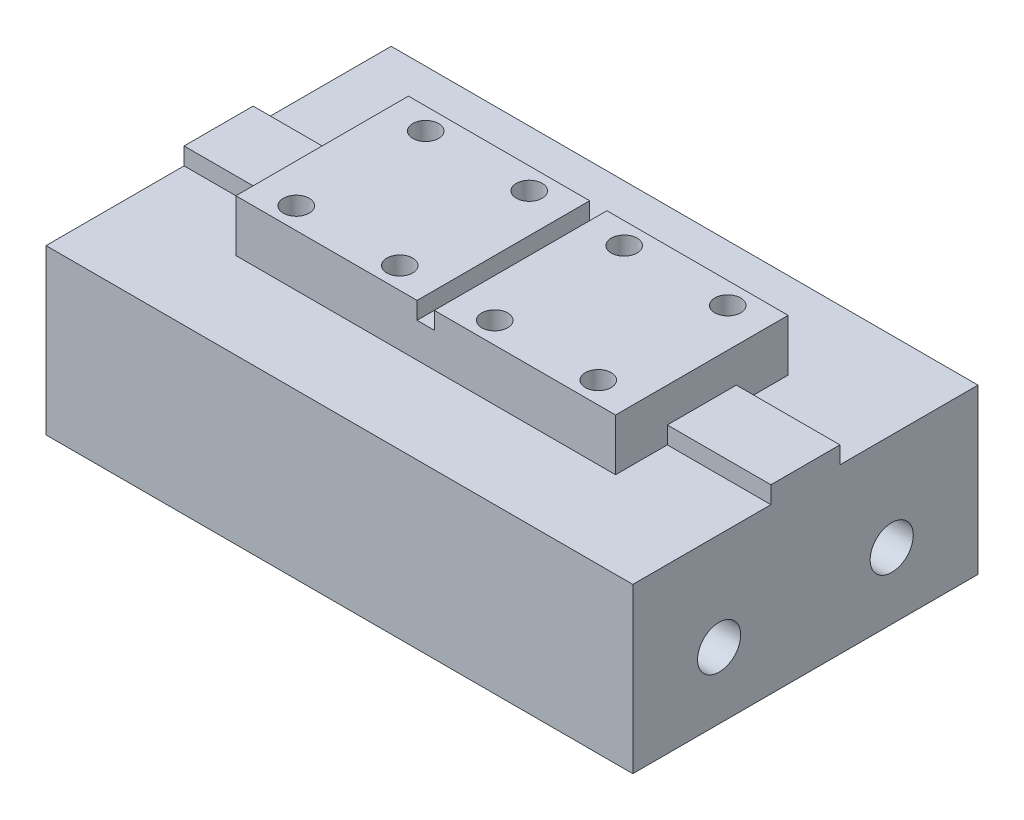
ISO-10303-21;
HEADER;
FILE_DESCRIPTION(('STEP AP214'),'2;1');
FILE_NAME('part.step','',(''),(''),'','','');
FILE_SCHEMA(('AUTOMOTIVE_DESIGN { 1 0 10303 214 1 1 1 1 }'));
ENDSEC;
DATA;
#1=APPLICATION_CONTEXT('core data for automotive mechanical design processes');
#2=APPLICATION_PROTOCOL_DEFINITION('international standard','automotive_design',2000,#1);
#3=PRODUCT_CONTEXT('',#1,'mechanical');
#4=PRODUCT('Part','Part','',(#3));
#5=PRODUCT_RELATED_PRODUCT_CATEGORY('part','',(#4));
#6=PRODUCT_DEFINITION_FORMATION('','',#4);
#7=PRODUCT_DEFINITION_CONTEXT('part definition',#1,'design');
#8=PRODUCT_DEFINITION('design','',#6,#7);
#9=PRODUCT_DEFINITION_SHAPE('','',#8);
#10=(LENGTH_UNIT() NAMED_UNIT(*) SI_UNIT(.MILLI.,.METRE.));
#11=(NAMED_UNIT(*) PLANE_ANGLE_UNIT() SI_UNIT($,.RADIAN.));
#12=(NAMED_UNIT(*) SI_UNIT($,.STERADIAN.) SOLID_ANGLE_UNIT());
#13=UNCERTAINTY_MEASURE_WITH_UNIT(LENGTH_MEASURE(1.E-05),#10,'distance_accuracy_value','');
#14=(GEOMETRIC_REPRESENTATION_CONTEXT(3) GLOBAL_UNCERTAINTY_ASSIGNED_CONTEXT((#13)) GLOBAL_UNIT_ASSIGNED_CONTEXT((#10,
#11,#12)) REPRESENTATION_CONTEXT('',''));
#15=CARTESIAN_POINT('',(0.,0.,0.));
#16=DIRECTION('',(0.,0.,1.));
#17=DIRECTION('',(1.,0.,0.));
#18=AXIS2_PLACEMENT_3D('',#15,#16,#17);
#19=CARTESIAN_POINT('',(0.,19.,0.));
#20=DIRECTION('',(0.,-1.,0.));
#21=DIRECTION('',(0.,0.,-1.));
#22=AXIS2_PLACEMENT_3D('',#19,#20,#21);
#23=PLANE('',#22);
#24=DIRECTION('',(1.,0.,0.));
#25=VECTOR('',#24,1.);
#26=CARTESIAN_POINT('',(-34.,19.,4.));
#27=LINE('',#26,#25);
#28=CARTESIAN_POINT('',(-34.,19.,4.));
#29=VERTEX_POINT('',#28);
#30=CARTESIAN_POINT('',(-22.,19.,4.));
#31=VERTEX_POINT('',#30);
#32=EDGE_CURVE('E50',#29,#31,#27,.T.);
#33=ORIENTED_EDGE('',*,*,#32,.F.);
#34=DIRECTION('',(0.,0.,1.));
#35=VECTOR('',#34,1.);
#36=CARTESIAN_POINT('',(-34.,19.,20.));
#37=LINE('',#36,#35);
#38=CARTESIAN_POINT('',(-34.,19.,20.));
#39=VERTEX_POINT('',#38);
#40=EDGE_CURVE('E396',#29,#39,#37,.T.);
#41=ORIENTED_EDGE('',*,*,#40,.T.);
#42=DIRECTION('',(1.,0.,0.));
#43=VECTOR('',#42,1.);
#44=CARTESIAN_POINT('',(-34.,19.,20.));
#45=LINE('',#44,#43);
#46=CARTESIAN_POINT('',(34.,19.,20.));
#47=VERTEX_POINT('',#46);
#48=EDGE_CURVE('E395',#39,#47,#45,.T.);
#49=ORIENTED_EDGE('',*,*,#48,.T.);
#50=DIRECTION('',(0.,0.,-1.));
#51=VECTOR('',#50,1.);
#52=CARTESIAN_POINT('',(34.,19.,20.));
#53=LINE('',#52,#51);
#54=CARTESIAN_POINT('',(34.,19.,4.));
#55=VERTEX_POINT('',#54);
#56=EDGE_CURVE('E399',#47,#55,#53,.T.);
#57=ORIENTED_EDGE('',*,*,#56,.T.);
#58=CARTESIAN_POINT('',(22.,19.,4.));
#59=VERTEX_POINT('',#58);
#60=EDGE_CURVE('E288',#59,#55,#27,.T.);
#61=ORIENTED_EDGE('',*,*,#60,.F.);
#62=DIRECTION('',(0.,0.,-1.));
#63=VECTOR('',#62,1.);
#64=CARTESIAN_POINT('',(22.,19.,10.));
#65=LINE('',#64,#63);
#66=CARTESIAN_POINT('',(22.,19.,10.));
#67=VERTEX_POINT('',#66);
#68=EDGE_CURVE('E377',#67,#59,#65,.T.);
#69=ORIENTED_EDGE('',*,*,#68,.F.);
#70=DIRECTION('',(1.,0.,0.));
#71=VECTOR('',#70,1.);
#72=CARTESIAN_POINT('',(-22.,19.,10.));
#73=LINE('',#72,#71);
#74=CARTESIAN_POINT('',(-22.,19.,10.));
#75=VERTEX_POINT('',#74);
#76=EDGE_CURVE('E373',#75,#67,#73,.T.);
#77=ORIENTED_EDGE('',*,*,#76,.F.);
#78=DIRECTION('',(0.,0.,1.));
#79=VECTOR('',#78,1.);
#80=CARTESIAN_POINT('',(-22.,19.,10.));
#81=LINE('',#80,#79);
#82=EDGE_CURVE('E347',#31,#75,#81,.T.);
#83=ORIENTED_EDGE('',*,*,#82,.F.);
#84=EDGE_LOOP('',(#33,#41,#49,#57,#61,#69,#77,#83));
#85=FACE_BOUND('',#84,.T.);
#86=ADVANCED_FACE('F35',(#85),#23,.F.);
#87=DIRECTION('',(-1.,0.,0.));
#88=VECTOR('',#87,1.);
#89=CARTESIAN_POINT('',(-34.,19.,-4.));
#90=LINE('',#89,#88);
#91=CARTESIAN_POINT('',(34.,19.,-4.));
#92=VERTEX_POINT('',#91);
#93=CARTESIAN_POINT('',(22.,19.,-4.));
#94=VERTEX_POINT('',#93);
#95=EDGE_CURVE('E293',#92,#94,#90,.T.);
#96=ORIENTED_EDGE('',*,*,#95,.F.);
#97=CARTESIAN_POINT('',(34.,19.,-20.));
#98=VERTEX_POINT('',#97);
#99=EDGE_CURVE('E398',#92,#98,#53,.T.);
#100=ORIENTED_EDGE('',*,*,#99,.T.);
#101=DIRECTION('',(-1.,0.,0.));
#102=VECTOR('',#101,1.);
#103=CARTESIAN_POINT('',(-34.,19.,-20.));
#104=LINE('',#103,#102);
#105=CARTESIAN_POINT('',(-34.,19.,-20.));
#106=VERTEX_POINT('',#105);
#107=EDGE_CURVE('E401',#98,#106,#104,.T.);
#108=ORIENTED_EDGE('',*,*,#107,.T.);
#109=CARTESIAN_POINT('',(-34.,19.,-4.));
#110=VERTEX_POINT('',#109);
#111=EDGE_CURVE('E58',#106,#110,#37,.T.);
#112=ORIENTED_EDGE('',*,*,#111,.T.);
#113=CARTESIAN_POINT('',(-22.,19.,-4.));
#114=VERTEX_POINT('',#113);
#115=EDGE_CURVE('E305',#114,#110,#90,.T.);
#116=ORIENTED_EDGE('',*,*,#115,.F.);
#117=CARTESIAN_POINT('',(-22.,19.,-10.));
#118=VERTEX_POINT('',#117);
#119=EDGE_CURVE('E370',#118,#114,#81,.T.);
#120=ORIENTED_EDGE('',*,*,#119,.F.);
#121=DIRECTION('',(-1.,0.,0.));
#122=VECTOR('',#121,1.);
#123=CARTESIAN_POINT('',(-22.,19.,-10.));
#124=LINE('',#123,#122);
#125=CARTESIAN_POINT('',(22.,19.,-10.));
#126=VERTEX_POINT('',#125);
#127=EDGE_CURVE('E359',#126,#118,#124,.T.);
#128=ORIENTED_EDGE('',*,*,#127,.F.);
#129=EDGE_CURVE('E376',#94,#126,#65,.T.);
#130=ORIENTED_EDGE('',*,*,#129,.F.);
#131=EDGE_LOOP('',(#96,#100,#108,#112,#116,#120,#128,#130));
#132=FACE_BOUND('',#131,.T.);
#133=ADVANCED_FACE('F442',(#132),#23,.F.);
#134=CARTESIAN_POINT('',(-22.,25.,10.));
#135=DIRECTION('',(1.,0.,0.));
#136=DIRECTION('',(0.,0.,-1.));
#137=AXIS2_PLACEMENT_3D('',#134,#135,#136);
#138=PLANE('',#137);
#139=DIRECTION('',(0.,1.,0.));
#140=VECTOR('',#139,1.);
#141=CARTESIAN_POINT('',(-22.,25.,4.));
#142=LINE('',#141,#140);
#143=CARTESIAN_POINT('',(-22.,21.,4.));
#144=VERTEX_POINT('',#143);
#145=EDGE_CURVE('E325',#31,#144,#142,.T.);
#146=ORIENTED_EDGE('',*,*,#145,.F.);
#147=ORIENTED_EDGE('',*,*,#82,.T.);
#148=DIRECTION('',(0.,-1.,0.));
#149=VECTOR('',#148,1.);
#150=CARTESIAN_POINT('',(-22.,25.,10.));
#151=LINE('',#150,#149);
#152=CARTESIAN_POINT('',(-22.,25.,10.));
#153=VERTEX_POINT('',#152);
#154=EDGE_CURVE('E390',#153,#75,#151,.T.);
#155=ORIENTED_EDGE('',*,*,#154,.F.);
#156=DIRECTION('',(0.,0.,1.));
#157=VECTOR('',#156,1.);
#158=CARTESIAN_POINT('',(-22.,25.,10.));
#159=LINE('',#158,#157);
#160=CARTESIAN_POINT('',(-22.,25.,-10.));
#161=VERTEX_POINT('',#160);
#162=EDGE_CURVE('E355',#161,#153,#159,.T.);
#163=ORIENTED_EDGE('',*,*,#162,.F.);
#164=DIRECTION('',(0.,-1.,0.));
#165=VECTOR('',#164,1.);
#166=CARTESIAN_POINT('',(-22.,25.,-10.));
#167=LINE('',#166,#165);
#168=EDGE_CURVE('E369',#161,#118,#167,.T.);
#169=ORIENTED_EDGE('',*,*,#168,.T.);
#170=ORIENTED_EDGE('',*,*,#119,.T.);
#171=DIRECTION('',(0.,-1.,0.));
#172=VECTOR('',#171,1.);
#173=CARTESIAN_POINT('',(-22.,25.,-4.));
#174=LINE('',#173,#172);
#175=CARTESIAN_POINT('',(-22.,21.,-4.));
#176=VERTEX_POINT('',#175);
#177=EDGE_CURVE('E322',#176,#114,#174,.T.);
#178=ORIENTED_EDGE('',*,*,#177,.F.);
#179=DIRECTION('',(0.,0.,-1.));
#180=VECTOR('',#179,1.);
#181=CARTESIAN_POINT('',(-22.,21.,10.));
#182=LINE('',#181,#180);
#183=EDGE_CURVE('E319',#144,#176,#182,.T.);
#184=ORIENTED_EDGE('',*,*,#183,.F.);
#185=EDGE_LOOP('',(#146,#147,#155,#163,#169,#170,#178,#184));
#186=FACE_BOUND('',#185,.T.);
#187=ADVANCED_FACE('F487',(#186),#138,.F.);
#188=CARTESIAN_POINT('',(22.,25.,10.));
#189=DIRECTION('',(-1.,0.,0.));
#190=DIRECTION('',(0.,0.,1.));
#191=AXIS2_PLACEMENT_3D('',#188,#189,#190);
#192=PLANE('',#191);
#193=DIRECTION('',(0.,-1.,0.));
#194=VECTOR('',#193,1.);
#195=CARTESIAN_POINT('',(22.,25.,4.));
#196=LINE('',#195,#194);
#197=CARTESIAN_POINT('',(22.,21.,4.));
#198=VERTEX_POINT('',#197);
#199=EDGE_CURVE('E11',#198,#59,#196,.T.);
#200=ORIENTED_EDGE('',*,*,#199,.F.);
#201=DIRECTION('',(0.,0.,1.));
#202=VECTOR('',#201,1.);
#203=CARTESIAN_POINT('',(22.,21.,10.));
#204=LINE('',#203,#202);
#205=CARTESIAN_POINT('',(22.,21.,-4.));
#206=VERTEX_POINT('',#205);
#207=EDGE_CURVE('E423',#206,#198,#204,.T.);
#208=ORIENTED_EDGE('',*,*,#207,.F.);
#209=DIRECTION('',(0.,1.,0.));
#210=VECTOR('',#209,1.);
#211=CARTESIAN_POINT('',(22.,25.,-4.));
#212=LINE('',#211,#210);
#213=EDGE_CURVE('E43',#94,#206,#212,.T.);
#214=ORIENTED_EDGE('',*,*,#213,.F.);
#215=ORIENTED_EDGE('',*,*,#129,.T.);
#216=DIRECTION('',(0.,-1.,0.));
#217=VECTOR('',#216,1.);
#218=CARTESIAN_POINT('',(22.,25.,-10.));
#219=LINE('',#218,#217);
#220=CARTESIAN_POINT('',(22.,25.,-10.));
#221=VERTEX_POINT('',#220);
#222=EDGE_CURVE('E384',#221,#126,#219,.T.);
#223=ORIENTED_EDGE('',*,*,#222,.F.);
#224=DIRECTION('',(0.,0.,-1.));
#225=VECTOR('',#224,1.);
#226=CARTESIAN_POINT('',(22.,25.,10.));
#227=LINE('',#226,#225);
#228=CARTESIAN_POINT('',(22.,25.,10.));
#229=VERTEX_POINT('',#228);
#230=EDGE_CURVE('E363',#229,#221,#227,.T.);
#231=ORIENTED_EDGE('',*,*,#230,.F.);
#232=DIRECTION('',(0.,-1.,0.));
#233=VECTOR('',#232,1.);
#234=CARTESIAN_POINT('',(22.,25.,10.));
#235=LINE('',#234,#233);
#236=EDGE_CURVE('E387',#229,#67,#235,.T.);
#237=ORIENTED_EDGE('',*,*,#236,.T.);
#238=ORIENTED_EDGE('',*,*,#68,.T.);
#239=EDGE_LOOP('',(#200,#208,#214,#215,#223,#231,#237,#238));
#240=FACE_BOUND('',#239,.T.);
#241=ADVANCED_FACE('F446',(#240),#192,.F.);
#242=CARTESIAN_POINT('',(0.,25.,0.));
#243=DIRECTION('',(0.,-1.,0.));
#244=DIRECTION('',(0.,0.,-1.));
#245=AXIS2_PLACEMENT_3D('',#242,#243,#244);
#246=PLANE('',#245);
#247=CARTESIAN_POINT('',(-17.5,25.,-7.5));
#248=DIRECTION('',(0.,1.,0.));
#249=DIRECTION('',(0.,0.,1.));
#250=AXIS2_PLACEMENT_3D('',#247,#248,#249);
#251=CIRCLE('',#250,1.5);
#252=CARTESIAN_POINT('',(-17.5,25.,-6.));
#253=VERTEX_POINT('',#252);
#254=EDGE_CURVE('E240',#253,#253,#251,.T.);
#255=ORIENTED_EDGE('',*,*,#254,.F.);
#256=EDGE_LOOP('',(#255));
#257=FACE_BOUND('',#256,.T.);
#258=CARTESIAN_POINT('',(-17.5,25.,7.5));
#259=DIRECTION('',(0.,1.,0.));
#260=DIRECTION('',(0.,0.,1.));
#261=AXIS2_PLACEMENT_3D('',#258,#259,#260);
#262=CIRCLE('',#261,1.5);
#263=CARTESIAN_POINT('',(-17.5,25.,9.));
#264=VERTEX_POINT('',#263);
#265=EDGE_CURVE('E246',#264,#264,#262,.T.);
#266=ORIENTED_EDGE('',*,*,#265,.F.);
#267=EDGE_LOOP('',(#266));
#268=FACE_BOUND('',#267,.T.);
#269=CARTESIAN_POINT('',(-5.5,25.,7.5));
#270=DIRECTION('',(0.,1.,0.));
#271=DIRECTION('',(0.,0.,1.));
#272=AXIS2_PLACEMENT_3D('',#269,#270,#271);
#273=CIRCLE('',#272,1.5);
#274=CARTESIAN_POINT('',(-5.5,25.,9.));
#275=VERTEX_POINT('',#274);
#276=EDGE_CURVE('E252',#275,#275,#273,.T.);
#277=ORIENTED_EDGE('',*,*,#276,.F.);
#278=EDGE_LOOP('',(#277));
#279=FACE_BOUND('',#278,.T.);
#280=CARTESIAN_POINT('',(-5.5,25.,-7.5));
#281=DIRECTION('',(0.,1.,0.));
#282=DIRECTION('',(0.,0.,1.));
#283=AXIS2_PLACEMENT_3D('',#280,#281,#282);
#284=CIRCLE('',#283,1.5);
#285=CARTESIAN_POINT('',(-5.5,25.,-6.));
#286=VERTEX_POINT('',#285);
#287=EDGE_CURVE('E258',#286,#286,#284,.T.);
#288=ORIENTED_EDGE('',*,*,#287,.F.);
#289=EDGE_LOOP('',(#288));
#290=FACE_BOUND('',#289,.T.);
#291=DIRECTION('',(1.,0.,0.));
#292=VECTOR('',#291,1.);
#293=CARTESIAN_POINT('',(-22.,25.,10.));
#294=LINE('',#293,#292);
#295=CARTESIAN_POINT('',(-1.,25.,10.));
#296=VERTEX_POINT('',#295);
#297=EDGE_CURVE('E360',#153,#296,#294,.T.);
#298=ORIENTED_EDGE('',*,*,#297,.T.);
#299=DIRECTION('',(0.,0.,1.));
#300=VECTOR('',#299,1.);
#301=CARTESIAN_POINT('',(-1.,25.,10.));
#302=LINE('',#301,#300);
#303=CARTESIAN_POINT('',(-1.,25.,-9.99999999999999));
#304=VERTEX_POINT('',#303);
#305=EDGE_CURVE('E328',#304,#296,#302,.T.);
#306=ORIENTED_EDGE('',*,*,#305,.F.);
#307=DIRECTION('',(-1.,0.,0.));
#308=VECTOR('',#307,1.);
#309=CARTESIAN_POINT('',(-22.,25.,-10.));
#310=LINE('',#309,#308);
#311=EDGE_CURVE('E365',#304,#161,#310,.T.);
#312=ORIENTED_EDGE('',*,*,#311,.T.);
#313=ORIENTED_EDGE('',*,*,#162,.T.);
#314=EDGE_LOOP('',(#298,#306,#312,#313));
#315=FACE_BOUND('',#314,.T.);
#316=ADVANCED_FACE('F494',(#257,#268,#279,#290,#315),#246,.F.);
#317=CARTESIAN_POINT('',(-34.,19.,20.));
#318=DIRECTION('',(1.,0.,0.));
#319=DIRECTION('',(0.,0.,-1.));
#320=AXIS2_PLACEMENT_3D('',#317,#318,#319);
#321=PLANE('',#320);
#322=DIRECTION('',(0.,0.,1.));
#323=VECTOR('',#322,1.);
#324=CARTESIAN_POINT('',(-34.,0.,20.));
#325=LINE('',#324,#323);
#326=CARTESIAN_POINT('',(-34.,0.,-20.));
#327=VERTEX_POINT('',#326);
#328=CARTESIAN_POINT('',(-34.,0.,20.));
#329=VERTEX_POINT('',#328);
#330=EDGE_CURVE('E393',#327,#329,#325,.T.);
#331=ORIENTED_EDGE('',*,*,#330,.T.);
#332=DIRECTION('',(0.,-1.,0.));
#333=VECTOR('',#332,1.);
#334=CARTESIAN_POINT('',(-34.,19.,20.));
#335=LINE('',#334,#333);
#336=EDGE_CURVE('E420',#39,#329,#335,.T.);
#337=ORIENTED_EDGE('',*,*,#336,.F.);
#338=ORIENTED_EDGE('',*,*,#40,.F.);
#339=DIRECTION('',(0.,-1.,0.));
#340=VECTOR('',#339,1.);
#341=CARTESIAN_POINT('',(-34.,21.,4.));
#342=LINE('',#341,#340);
#343=CARTESIAN_POINT('',(-34.,21.,4.));
#344=VERTEX_POINT('',#343);
#345=EDGE_CURVE('E316',#344,#29,#342,.T.);
#346=ORIENTED_EDGE('',*,*,#345,.F.);
#347=DIRECTION('',(0.,0.,1.));
#348=VECTOR('',#347,1.);
#349=CARTESIAN_POINT('',(-34.,21.,4.));
#350=LINE('',#349,#348);
#351=CARTESIAN_POINT('',(-34.,21.,-4.));
#352=VERTEX_POINT('',#351);
#353=EDGE_CURVE('E289',#352,#344,#350,.T.);
#354=ORIENTED_EDGE('',*,*,#353,.F.);
#355=DIRECTION('',(0.,-1.,0.));
#356=VECTOR('',#355,1.);
#357=CARTESIAN_POINT('',(-34.,21.,-4.));
#358=LINE('',#357,#356);
#359=EDGE_CURVE('E303',#352,#110,#358,.T.);
#360=ORIENTED_EDGE('',*,*,#359,.T.);
#361=ORIENTED_EDGE('',*,*,#111,.F.);
#362=DIRECTION('',(0.,-1.,0.));
#363=VECTOR('',#362,1.);
#364=CARTESIAN_POINT('',(-34.,19.,-20.));
#365=LINE('',#364,#363);
#366=EDGE_CURVE('E403',#106,#327,#365,.T.);
#367=ORIENTED_EDGE('',*,*,#366,.T.);
#368=EDGE_LOOP('',(#331,#337,#338,#346,#354,#360,#361,#367));
#369=FACE_BOUND('',#368,.T.);
#370=ADVANCED_FACE('F37',(#369),#321,.F.);
#371=CARTESIAN_POINT('',(-34.,19.,20.));
#372=DIRECTION('',(0.,0.,-1.));
#373=DIRECTION('',(-1.,0.,0.));
#374=AXIS2_PLACEMENT_3D('',#371,#372,#373);
#375=PLANE('',#374);
#376=DIRECTION('',(1.,0.,0.));
#377=VECTOR('',#376,1.);
#378=CARTESIAN_POINT('',(-34.,0.,20.));
#379=LINE('',#378,#377);
#380=CARTESIAN_POINT('',(34.,0.,20.));
#381=VERTEX_POINT('',#380);
#382=EDGE_CURVE('E406',#329,#381,#379,.T.);
#383=ORIENTED_EDGE('',*,*,#382,.T.);
#384=DIRECTION('',(0.,-1.,0.));
#385=VECTOR('',#384,1.);
#386=CARTESIAN_POINT('',(34.,19.,20.));
#387=LINE('',#386,#385);
#388=EDGE_CURVE('E417',#47,#381,#387,.T.);
#389=ORIENTED_EDGE('',*,*,#388,.F.);
#390=ORIENTED_EDGE('',*,*,#48,.F.);
#391=ORIENTED_EDGE('',*,*,#336,.T.);
#392=EDGE_LOOP('',(#383,#389,#390,#391));
#393=FACE_BOUND('',#392,.T.);
#394=ADVANCED_FACE('F472',(#393),#375,.F.);
#395=CARTESIAN_POINT('',(34.,19.,20.));
#396=DIRECTION('',(-1.,0.,0.));
#397=DIRECTION('',(0.,0.,1.));
#398=AXIS2_PLACEMENT_3D('',#395,#396,#397);
#399=PLANE('',#398);
#400=CARTESIAN_POINT('',(34.,7.7,-10.));
#401=DIRECTION('',(1.,0.,0.));
#402=DIRECTION('',(0.,0.,-1.));
#403=AXIS2_PLACEMENT_3D('',#400,#401,#402);
#404=CIRCLE('',#403,2.5);
#405=CARTESIAN_POINT('',(34.,7.7,-12.5));
#406=VERTEX_POINT('',#405);
#407=EDGE_CURVE('E218',#406,#406,#404,.T.);
#408=ORIENTED_EDGE('',*,*,#407,.F.);
#409=EDGE_LOOP('',(#408));
#410=FACE_BOUND('',#409,.T.);
#411=CARTESIAN_POINT('',(34.,7.7,9.99999999999999));
#412=DIRECTION('',(1.,0.,0.));
#413=DIRECTION('',(0.,0.,-1.));
#414=AXIS2_PLACEMENT_3D('',#411,#412,#413);
#415=CIRCLE('',#414,2.5);
#416=CARTESIAN_POINT('',(34.,7.7,7.49999999999999));
#417=VERTEX_POINT('',#416);
#418=EDGE_CURVE('E217',#417,#417,#415,.T.);
#419=ORIENTED_EDGE('',*,*,#418,.F.);
#420=EDGE_LOOP('',(#419));
#421=FACE_BOUND('',#420,.T.);
#422=DIRECTION('',(0.,0.,-1.));
#423=VECTOR('',#422,1.);
#424=CARTESIAN_POINT('',(34.,0.,20.));
#425=LINE('',#424,#423);
#426=CARTESIAN_POINT('',(34.,0.,-20.));
#427=VERTEX_POINT('',#426);
#428=EDGE_CURVE('E408',#381,#427,#425,.T.);
#429=ORIENTED_EDGE('',*,*,#428,.T.);
#430=DIRECTION('',(0.,-1.,0.));
#431=VECTOR('',#430,1.);
#432=CARTESIAN_POINT('',(34.,19.,-20.));
#433=LINE('',#432,#431);
#434=EDGE_CURVE('E414',#98,#427,#433,.T.);
#435=ORIENTED_EDGE('',*,*,#434,.F.);
#436=ORIENTED_EDGE('',*,*,#99,.F.);
#437=DIRECTION('',(0.,-1.,0.));
#438=VECTOR('',#437,1.);
#439=CARTESIAN_POINT('',(34.,21.,-4.));
#440=LINE('',#439,#438);
#441=CARTESIAN_POINT('',(34.,21.,-4.));
#442=VERTEX_POINT('',#441);
#443=EDGE_CURVE('E310',#442,#92,#440,.T.);
#444=ORIENTED_EDGE('',*,*,#443,.F.);
#445=DIRECTION('',(0.,0.,-1.));
#446=VECTOR('',#445,1.);
#447=CARTESIAN_POINT('',(34.,21.,4.));
#448=LINE('',#447,#446);
#449=CARTESIAN_POINT('',(34.,21.,4.));
#450=VERTEX_POINT('',#449);
#451=EDGE_CURVE('E297',#450,#442,#448,.T.);
#452=ORIENTED_EDGE('',*,*,#451,.F.);
#453=DIRECTION('',(0.,-1.,0.));
#454=VECTOR('',#453,1.);
#455=CARTESIAN_POINT('',(34.,21.,4.));
#456=LINE('',#455,#454);
#457=EDGE_CURVE('E313',#450,#55,#456,.T.);
#458=ORIENTED_EDGE('',*,*,#457,.T.);
#459=ORIENTED_EDGE('',*,*,#56,.F.);
#460=ORIENTED_EDGE('',*,*,#388,.T.);
#461=EDGE_LOOP('',(#429,#435,#436,#444,#452,#458,#459,#460));
#462=FACE_BOUND('',#461,.T.);
#463=ADVANCED_FACE('F439',(#410,#421,#462),#399,.F.);
#464=CARTESIAN_POINT('',(-34.,19.,-20.));
#465=DIRECTION('',(0.,0.,1.));
#466=DIRECTION('',(1.,0.,0.));
#467=AXIS2_PLACEMENT_3D('',#464,#465,#466);
#468=PLANE('',#467);
#469=DIRECTION('',(-1.,0.,0.));
#470=VECTOR('',#469,1.);
#471=CARTESIAN_POINT('',(-34.,0.,-20.));
#472=LINE('',#471,#470);
#473=EDGE_CURVE('E410',#427,#327,#472,.T.);
#474=ORIENTED_EDGE('',*,*,#473,.T.);
#475=ORIENTED_EDGE('',*,*,#366,.F.);
#476=ORIENTED_EDGE('',*,*,#107,.F.);
#477=ORIENTED_EDGE('',*,*,#434,.T.);
#478=EDGE_LOOP('',(#474,#475,#476,#477));
#479=FACE_BOUND('',#478,.T.);
#480=ADVANCED_FACE('F478',(#479),#468,.F.);
#481=CARTESIAN_POINT('',(0.,0.,0.));
#482=DIRECTION('',(0.,-1.,0.));
#483=DIRECTION('',(0.,0.,-1.));
#484=AXIS2_PLACEMENT_3D('',#481,#482,#483);
#485=PLANE('',#484);
#486=CARTESIAN_POINT('',(21.,0.,0.));
#487=DIRECTION('',(0.,-1.,0.));
#488=DIRECTION('',(0.,0.,-1.));
#489=AXIS2_PLACEMENT_3D('',#486,#487,#488);
#490=CIRCLE('',#489,2.);
#491=CARTESIAN_POINT('',(21.,0.,-2.));
#492=VERTEX_POINT('',#491);
#493=EDGE_CURVE('E228',#492,#492,#490,.T.);
#494=ORIENTED_EDGE('',*,*,#493,.F.);
#495=EDGE_LOOP('',(#494));
#496=FACE_BOUND('',#495,.T.);
#497=CARTESIAN_POINT('',(-21.,0.,0.));
#498=DIRECTION('',(0.,-1.,0.));
#499=DIRECTION('',(0.,0.,-1.));
#500=AXIS2_PLACEMENT_3D('',#497,#498,#499);
#501=CIRCLE('',#500,2.);
#502=CARTESIAN_POINT('',(-21.,0.,-2.));
#503=VERTEX_POINT('',#502);
#504=EDGE_CURVE('E234',#503,#503,#501,.T.);
#505=ORIENTED_EDGE('',*,*,#504,.F.);
#506=EDGE_LOOP('',(#505));
#507=FACE_BOUND('',#506,.T.);
#508=ORIENTED_EDGE('',*,*,#330,.F.);
#509=ORIENTED_EDGE('',*,*,#473,.F.);
#510=ORIENTED_EDGE('',*,*,#428,.F.);
#511=ORIENTED_EDGE('',*,*,#382,.F.);
#512=EDGE_LOOP('',(#508,#509,#510,#511));
#513=FACE_BOUND('',#512,.T.);
#514=ADVANCED_FACE('F475',(#496,#507,#513),#485,.T.);
#515=CARTESIAN_POINT('',(-22.,25.,10.));
#516=DIRECTION('',(0.,0.,-1.));
#517=DIRECTION('',(-1.,0.,0.));
#518=AXIS2_PLACEMENT_3D('',#515,#516,#517);
#519=PLANE('',#518);
#520=DIRECTION('',(1.,0.,0.));
#521=VECTOR('',#520,1.);
#522=CARTESIAN_POINT('',(-1.,23.,10.));
#523=LINE('',#522,#521);
#524=CARTESIAN_POINT('',(-1.,23.,10.));
#525=VERTEX_POINT('',#524);
#526=CARTESIAN_POINT('',(1.,23.,10.));
#527=VERTEX_POINT('',#526);
#528=EDGE_CURVE('E332',#525,#527,#523,.T.);
#529=ORIENTED_EDGE('',*,*,#528,.F.);
#530=DIRECTION('',(0.,1.,0.));
#531=VECTOR('',#530,1.);
#532=CARTESIAN_POINT('',(-1.,23.,10.));
#533=LINE('',#532,#531);
#534=EDGE_CURVE('E342',#525,#296,#533,.T.);
#535=ORIENTED_EDGE('',*,*,#534,.T.);
#536=ORIENTED_EDGE('',*,*,#297,.F.);
#537=ORIENTED_EDGE('',*,*,#154,.T.);
#538=ORIENTED_EDGE('',*,*,#76,.T.);
#539=ORIENTED_EDGE('',*,*,#236,.F.);
#540=CARTESIAN_POINT('',(1.,25.,10.));
#541=VERTEX_POINT('',#540);
#542=EDGE_CURVE('E358',#541,#229,#294,.T.);
#543=ORIENTED_EDGE('',*,*,#542,.F.);
#544=DIRECTION('',(0.,1.,0.));
#545=VECTOR('',#544,1.);
#546=CARTESIAN_POINT('',(1.,23.,10.));
#547=LINE('',#546,#545);
#548=EDGE_CURVE('E351',#527,#541,#547,.T.);
#549=ORIENTED_EDGE('',*,*,#548,.F.);
#550=EDGE_LOOP('',(#529,#535,#536,#537,#538,#539,#543,#549));
#551=FACE_BOUND('',#550,.T.);
#552=ADVANCED_FACE('F461',(#551),#519,.F.);
#553=CARTESIAN_POINT('',(-22.,25.,-10.));
#554=DIRECTION('',(0.,0.,1.));
#555=DIRECTION('',(1.,0.,0.));
#556=AXIS2_PLACEMENT_3D('',#553,#554,#555);
#557=PLANE('',#556);
#558=ORIENTED_EDGE('',*,*,#311,.F.);
#559=DIRECTION('',(0.,1.,0.));
#560=VECTOR('',#559,1.);
#561=CARTESIAN_POINT('',(-1.,23.,-9.99999999999999));
#562=LINE('',#561,#560);
#563=CARTESIAN_POINT('',(-1.,23.,-9.99999999999999));
#564=VERTEX_POINT('',#563);
#565=EDGE_CURVE('E345',#564,#304,#562,.T.);
#566=ORIENTED_EDGE('',*,*,#565,.F.);
#567=DIRECTION('',(-1.,0.,0.));
#568=VECTOR('',#567,1.);
#569=CARTESIAN_POINT('',(-1.,23.,-9.99999999999999));
#570=LINE('',#569,#568);
#571=CARTESIAN_POINT('',(0.999999999999999,23.,-9.99999999999999));
#572=VERTEX_POINT('',#571);
#573=EDGE_CURVE('E339',#572,#564,#570,.T.);
#574=ORIENTED_EDGE('',*,*,#573,.F.);
#575=DIRECTION('',(0.,1.,0.));
#576=VECTOR('',#575,1.);
#577=CARTESIAN_POINT('',(0.999999999999999,23.,-9.99999999999999));
#578=LINE('',#577,#576);
#579=CARTESIAN_POINT('',(0.999999999999999,25.,-9.99999999999999));
#580=VERTEX_POINT('',#579);
#581=EDGE_CURVE('E348',#572,#580,#578,.T.);
#582=ORIENTED_EDGE('',*,*,#581,.T.);
#583=EDGE_CURVE('E366',#221,#580,#310,.T.);
#584=ORIENTED_EDGE('',*,*,#583,.F.);
#585=ORIENTED_EDGE('',*,*,#222,.T.);
#586=ORIENTED_EDGE('',*,*,#127,.T.);
#587=ORIENTED_EDGE('',*,*,#168,.F.);
#588=EDGE_LOOP('',(#558,#566,#574,#582,#584,#585,#586,#587));
#589=FACE_BOUND('',#588,.T.);
#590=ADVANCED_FACE('F451',(#589),#557,.F.);
#591=CARTESIAN_POINT('',(17.5,25.,-7.5));
#592=DIRECTION('',(0.,1.,0.));
#593=DIRECTION('',(0.,0.,1.));
#594=AXIS2_PLACEMENT_3D('',#591,#592,#593);
#595=CIRCLE('',#594,1.5);
#596=CARTESIAN_POINT('',(17.5,25.,-6.));
#597=VERTEX_POINT('',#596);
#598=EDGE_CURVE('E264',#597,#597,#595,.T.);
#599=ORIENTED_EDGE('',*,*,#598,.F.);
#600=EDGE_LOOP('',(#599));
#601=FACE_BOUND('',#600,.T.);
#602=CARTESIAN_POINT('',(17.5,25.,7.5));
#603=DIRECTION('',(0.,1.,0.));
#604=DIRECTION('',(0.,0.,1.));
#605=AXIS2_PLACEMENT_3D('',#602,#603,#604);
#606=CIRCLE('',#605,1.5);
#607=CARTESIAN_POINT('',(17.5,25.,9.));
#608=VERTEX_POINT('',#607);
#609=EDGE_CURVE('E270',#608,#608,#606,.T.);
#610=ORIENTED_EDGE('',*,*,#609,.F.);
#611=EDGE_LOOP('',(#610));
#612=FACE_BOUND('',#611,.T.);
#613=CARTESIAN_POINT('',(5.5,25.,7.5));
#614=DIRECTION('',(0.,1.,0.));
#615=DIRECTION('',(0.,0.,1.));
#616=AXIS2_PLACEMENT_3D('',#613,#614,#615);
#617=CIRCLE('',#616,1.5);
#618=CARTESIAN_POINT('',(5.5,25.,9.));
#619=VERTEX_POINT('',#618);
#620=EDGE_CURVE('E276',#619,#619,#617,.T.);
#621=ORIENTED_EDGE('',*,*,#620,.F.);
#622=EDGE_LOOP('',(#621));
#623=FACE_BOUND('',#622,.T.);
#624=CARTESIAN_POINT('',(5.5,25.,-7.5));
#625=DIRECTION('',(0.,1.,0.));
#626=DIRECTION('',(0.,0.,1.));
#627=AXIS2_PLACEMENT_3D('',#624,#625,#626);
#628=CIRCLE('',#627,1.5);
#629=CARTESIAN_POINT('',(5.5,25.,-6.));
#630=VERTEX_POINT('',#629);
#631=EDGE_CURVE('E282',#630,#630,#628,.T.);
#632=ORIENTED_EDGE('',*,*,#631,.F.);
#633=EDGE_LOOP('',(#632));
#634=FACE_BOUND('',#633,.T.);
#635=ORIENTED_EDGE('',*,*,#583,.T.);
#636=DIRECTION('',(0.,0.,-1.));
#637=VECTOR('',#636,1.);
#638=CARTESIAN_POINT('',(1.,25.,10.));
#639=LINE('',#638,#637);
#640=EDGE_CURVE('E333',#541,#580,#639,.T.);
#641=ORIENTED_EDGE('',*,*,#640,.F.);
#642=ORIENTED_EDGE('',*,*,#542,.T.);
#643=ORIENTED_EDGE('',*,*,#230,.T.);
#644=EDGE_LOOP('',(#635,#641,#642,#643));
#645=FACE_BOUND('',#644,.T.);
#646=ADVANCED_FACE('F455',(#601,#612,#623,#634,#645),#246,.F.);
#647=CARTESIAN_POINT('',(-1.,23.,10.));
#648=DIRECTION('',(-1.,0.,0.));
#649=DIRECTION('',(0.,0.,1.));
#650=AXIS2_PLACEMENT_3D('',#647,#648,#649);
#651=PLANE('',#650);
#652=ORIENTED_EDGE('',*,*,#305,.T.);
#653=ORIENTED_EDGE('',*,*,#534,.F.);
#654=DIRECTION('',(0.,0.,1.));
#655=VECTOR('',#654,1.);
#656=CARTESIAN_POINT('',(-1.,23.,10.));
#657=LINE('',#656,#655);
#658=EDGE_CURVE('E329',#564,#525,#657,.T.);
#659=ORIENTED_EDGE('',*,*,#658,.F.);
#660=ORIENTED_EDGE('',*,*,#565,.T.);
#661=EDGE_LOOP('',(#652,#653,#659,#660));
#662=FACE_BOUND('',#661,.T.);
#663=ADVANCED_FACE('F496',(#662),#651,.F.);
#664=CARTESIAN_POINT('',(1.,23.,10.));
#665=DIRECTION('',(1.,0.,0.));
#666=DIRECTION('',(0.,0.,-1.));
#667=AXIS2_PLACEMENT_3D('',#664,#665,#666);
#668=PLANE('',#667);
#669=ORIENTED_EDGE('',*,*,#640,.T.);
#670=ORIENTED_EDGE('',*,*,#581,.F.);
#671=DIRECTION('',(0.,0.,-1.));
#672=VECTOR('',#671,1.);
#673=CARTESIAN_POINT('',(1.,23.,10.));
#674=LINE('',#673,#672);
#675=EDGE_CURVE('E336',#527,#572,#674,.T.);
#676=ORIENTED_EDGE('',*,*,#675,.F.);
#677=ORIENTED_EDGE('',*,*,#548,.T.);
#678=EDGE_LOOP('',(#669,#670,#676,#677));
#679=FACE_BOUND('',#678,.T.);
#680=ADVANCED_FACE('F500',(#679),#668,.F.);
#681=CARTESIAN_POINT('',(0.,23.,0.));
#682=DIRECTION('',(0.,-1.,0.));
#683=DIRECTION('',(0.,0.,-1.));
#684=AXIS2_PLACEMENT_3D('',#681,#682,#683);
#685=PLANE('',#684);
#686=ORIENTED_EDGE('',*,*,#658,.T.);
#687=ORIENTED_EDGE('',*,*,#528,.T.);
#688=ORIENTED_EDGE('',*,*,#675,.T.);
#689=ORIENTED_EDGE('',*,*,#573,.T.);
#690=EDGE_LOOP('',(#686,#687,#688,#689));
#691=FACE_BOUND('',#690,.T.);
#692=ADVANCED_FACE('F498',(#691),#685,.F.);
#693=CARTESIAN_POINT('',(0.,21.,0.));
#694=DIRECTION('',(0.,-1.,0.));
#695=DIRECTION('',(0.,0.,-1.));
#696=AXIS2_PLACEMENT_3D('',#693,#694,#695);
#697=PLANE('',#696);
#698=DIRECTION('',(-1.,0.,0.));
#699=VECTOR('',#698,1.);
#700=CARTESIAN_POINT('',(-34.,21.,-4.));
#701=LINE('',#700,#699);
#702=EDGE_CURVE('E300',#442,#206,#701,.T.);
#703=ORIENTED_EDGE('',*,*,#702,.T.);
#704=ORIENTED_EDGE('',*,*,#207,.T.);
#705=DIRECTION('',(1.,0.,0.));
#706=VECTOR('',#705,1.);
#707=CARTESIAN_POINT('',(-34.,21.,4.));
#708=LINE('',#707,#706);
#709=EDGE_CURVE('E292',#198,#450,#708,.T.);
#710=ORIENTED_EDGE('',*,*,#709,.T.);
#711=ORIENTED_EDGE('',*,*,#451,.T.);
#712=EDGE_LOOP('',(#703,#704,#710,#711));
#713=FACE_BOUND('',#712,.T.);
#714=ADVANCED_FACE('F432',(#713),#697,.F.);
#715=CARTESIAN_POINT('',(-34.,21.,-4.));
#716=DIRECTION('',(0.,0.,1.));
#717=DIRECTION('',(1.,0.,0.));
#718=AXIS2_PLACEMENT_3D('',#715,#716,#717);
#719=PLANE('',#718);
#720=ORIENTED_EDGE('',*,*,#95,.T.);
#721=ORIENTED_EDGE('',*,*,#213,.T.);
#722=ORIENTED_EDGE('',*,*,#702,.F.);
#723=ORIENTED_EDGE('',*,*,#443,.T.);
#724=EDGE_LOOP('',(#720,#721,#722,#723));
#725=FACE_BOUND('',#724,.T.);
#726=ADVANCED_FACE('F428',(#725),#719,.F.);
#727=CARTESIAN_POINT('',(-34.,21.,4.));
#728=DIRECTION('',(0.,0.,-1.));
#729=DIRECTION('',(-1.,0.,0.));
#730=AXIS2_PLACEMENT_3D('',#727,#728,#729);
#731=PLANE('',#730);
#732=ORIENTED_EDGE('',*,*,#709,.F.);
#733=ORIENTED_EDGE('',*,*,#199,.T.);
#734=ORIENTED_EDGE('',*,*,#60,.T.);
#735=ORIENTED_EDGE('',*,*,#457,.F.);
#736=EDGE_LOOP('',(#732,#733,#734,#735));
#737=FACE_BOUND('',#736,.T.);
#738=ADVANCED_FACE('F465',(#737),#731,.F.);
#739=ORIENTED_EDGE('',*,*,#32,.T.);
#740=ORIENTED_EDGE('',*,*,#145,.T.);
#741=EDGE_CURVE('E294',#344,#144,#708,.T.);
#742=ORIENTED_EDGE('',*,*,#741,.F.);
#743=ORIENTED_EDGE('',*,*,#345,.T.);
#744=EDGE_LOOP('',(#739,#740,#742,#743));
#745=FACE_BOUND('',#744,.T.);
#746=ADVANCED_FACE('F577',(#745),#731,.F.);
#747=EDGE_CURVE('E299',#176,#352,#701,.T.);
#748=ORIENTED_EDGE('',*,*,#747,.F.);
#749=ORIENTED_EDGE('',*,*,#177,.T.);
#750=ORIENTED_EDGE('',*,*,#115,.T.);
#751=ORIENTED_EDGE('',*,*,#359,.F.);
#752=EDGE_LOOP('',(#748,#749,#750,#751));
#753=FACE_BOUND('',#752,.T.);
#754=ADVANCED_FACE('F485',(#753),#719,.F.);
#755=ORIENTED_EDGE('',*,*,#741,.T.);
#756=ORIENTED_EDGE('',*,*,#183,.T.);
#757=ORIENTED_EDGE('',*,*,#747,.T.);
#758=ORIENTED_EDGE('',*,*,#353,.T.);
#759=EDGE_LOOP('',(#755,#756,#757,#758));
#760=FACE_BOUND('',#759,.T.);
#761=ADVANCED_FACE('F566',(#760),#697,.F.);
#762=CARTESIAN_POINT('',(5.5,21.,-7.5));
#763=DIRECTION('',(0.,1.,0.));
#764=DIRECTION('',(0.,0.,1.));
#765=AXIS2_PLACEMENT_3D('',#762,#763,#764);
#766=CONICAL_SURFACE('',#765,1.5,1.02974425867665);
#767=CARTESIAN_POINT('',(5.5,20.0987090714587,-7.5));
#768=VERTEX_POINT('',#767);
#769=VERTEX_LOOP('',#768);
#770=FACE_BOUND('',#769,.T.);
#771=CARTESIAN_POINT('',(5.5,21.,-7.5));
#772=DIRECTION('',(0.,1.,0.));
#773=DIRECTION('',(0.,0.,1.));
#774=AXIS2_PLACEMENT_3D('',#771,#772,#773);
#775=CIRCLE('',#774,1.5);
#776=CARTESIAN_POINT('',(5.5,21.,-6.));
#777=VERTEX_POINT('',#776);
#778=EDGE_CURVE('E285',#777,#777,#775,.T.);
#779=ORIENTED_EDGE('',*,*,#778,.T.);
#780=EDGE_LOOP('',(#779));
#781=FACE_BOUND('',#780,.T.);
#782=ADVANCED_FACE('F556',(#770,#781),#766,.F.);
#783=CARTESIAN_POINT('',(5.5,25.,-7.5));
#784=DIRECTION('',(0.,1.,0.));
#785=DIRECTION('',(0.,0.,1.));
#786=AXIS2_PLACEMENT_3D('',#783,#784,#785);
#787=CYLINDRICAL_SURFACE('',#786,1.5);
#788=ORIENTED_EDGE('',*,*,#778,.F.);
#789=EDGE_LOOP('',(#788));
#790=FACE_BOUND('',#789,.T.);
#791=ORIENTED_EDGE('',*,*,#631,.T.);
#792=EDGE_LOOP('',(#791));
#793=FACE_BOUND('',#792,.T.);
#794=ADVANCED_FACE('F553',(#790,#793),#787,.F.);
#795=CARTESIAN_POINT('',(5.5,21.,7.5));
#796=DIRECTION('',(0.,1.,0.));
#797=DIRECTION('',(0.,0.,1.));
#798=AXIS2_PLACEMENT_3D('',#795,#796,#797);
#799=CONICAL_SURFACE('',#798,1.5,1.02974425867665);
#800=CARTESIAN_POINT('',(5.5,20.0987090714587,7.5));
#801=VERTEX_POINT('',#800);
#802=VERTEX_LOOP('',#801);
#803=FACE_BOUND('',#802,.T.);
#804=CARTESIAN_POINT('',(5.5,21.,7.5));
#805=DIRECTION('',(0.,1.,0.));
#806=DIRECTION('',(0.,0.,1.));
#807=AXIS2_PLACEMENT_3D('',#804,#805,#806);
#808=CIRCLE('',#807,1.5);
#809=CARTESIAN_POINT('',(5.5,21.,9.));
#810=VERTEX_POINT('',#809);
#811=EDGE_CURVE('E279',#810,#810,#808,.T.);
#812=ORIENTED_EDGE('',*,*,#811,.T.);
#813=EDGE_LOOP('',(#812));
#814=FACE_BOUND('',#813,.T.);
#815=ADVANCED_FACE('F555',(#803,#814),#799,.F.);
#816=CARTESIAN_POINT('',(5.5,25.,7.5));
#817=DIRECTION('',(0.,1.,0.));
#818=DIRECTION('',(0.,0.,1.));
#819=AXIS2_PLACEMENT_3D('',#816,#817,#818);
#820=CYLINDRICAL_SURFACE('',#819,1.5);
#821=ORIENTED_EDGE('',*,*,#811,.F.);
#822=EDGE_LOOP('',(#821));
#823=FACE_BOUND('',#822,.T.);
#824=ORIENTED_EDGE('',*,*,#620,.T.);
#825=EDGE_LOOP('',(#824));
#826=FACE_BOUND('',#825,.T.);
#827=ADVANCED_FACE('F563',(#823,#826),#820,.F.);
#828=CARTESIAN_POINT('',(17.5,21.,7.5));
#829=DIRECTION('',(0.,1.,0.));
#830=DIRECTION('',(0.,0.,1.));
#831=AXIS2_PLACEMENT_3D('',#828,#829,#830);
#832=CONICAL_SURFACE('',#831,1.5,1.02974425867665);
#833=CARTESIAN_POINT('',(17.5,20.0987090714587,7.5));
#834=VERTEX_POINT('',#833);
#835=VERTEX_LOOP('',#834);
#836=FACE_BOUND('',#835,.T.);
#837=CARTESIAN_POINT('',(17.5,21.,7.5));
#838=DIRECTION('',(0.,1.,0.));
#839=DIRECTION('',(0.,0.,1.));
#840=AXIS2_PLACEMENT_3D('',#837,#838,#839);
#841=CIRCLE('',#840,1.5);
#842=CARTESIAN_POINT('',(17.5,21.,9.));
#843=VERTEX_POINT('',#842);
#844=EDGE_CURVE('E273',#843,#843,#841,.T.);
#845=ORIENTED_EDGE('',*,*,#844,.T.);
#846=EDGE_LOOP('',(#845));
#847=FACE_BOUND('',#846,.T.);
#848=ADVANCED_FACE('F688',(#836,#847),#832,.F.);
#849=CARTESIAN_POINT('',(17.5,25.,7.5));
#850=DIRECTION('',(0.,1.,0.));
#851=DIRECTION('',(0.,0.,1.));
#852=AXIS2_PLACEMENT_3D('',#849,#850,#851);
#853=CYLINDRICAL_SURFACE('',#852,1.5);
#854=ORIENTED_EDGE('',*,*,#844,.F.);
#855=EDGE_LOOP('',(#854));
#856=FACE_BOUND('',#855,.T.);
#857=ORIENTED_EDGE('',*,*,#609,.T.);
#858=EDGE_LOOP('',(#857));
#859=FACE_BOUND('',#858,.T.);
#860=ADVANCED_FACE('F696',(#856,#859),#853,.F.);
#861=CARTESIAN_POINT('',(17.5,21.,-7.5));
#862=DIRECTION('',(0.,1.,0.));
#863=DIRECTION('',(0.,0.,1.));
#864=AXIS2_PLACEMENT_3D('',#861,#862,#863);
#865=CONICAL_SURFACE('',#864,1.5,1.02974425867665);
#866=CARTESIAN_POINT('',(17.5,20.0987090714587,-7.5));
#867=VERTEX_POINT('',#866);
#868=VERTEX_LOOP('',#867);
#869=FACE_BOUND('',#868,.T.);
#870=CARTESIAN_POINT('',(17.5,21.,-7.5));
#871=DIRECTION('',(0.,1.,0.));
#872=DIRECTION('',(0.,0.,1.));
#873=AXIS2_PLACEMENT_3D('',#870,#871,#872);
#874=CIRCLE('',#873,1.5);
#875=CARTESIAN_POINT('',(17.5,21.,-6.));
#876=VERTEX_POINT('',#875);
#877=EDGE_CURVE('E267',#876,#876,#874,.T.);
#878=ORIENTED_EDGE('',*,*,#877,.T.);
#879=EDGE_LOOP('',(#878));
#880=FACE_BOUND('',#879,.T.);
#881=ADVANCED_FACE('F705',(#869,#880),#865,.F.);
#882=CARTESIAN_POINT('',(17.5,25.,-7.5));
#883=DIRECTION('',(0.,1.,0.));
#884=DIRECTION('',(0.,0.,1.));
#885=AXIS2_PLACEMENT_3D('',#882,#883,#884);
#886=CYLINDRICAL_SURFACE('',#885,1.5);
#887=ORIENTED_EDGE('',*,*,#877,.F.);
#888=EDGE_LOOP('',(#887));
#889=FACE_BOUND('',#888,.T.);
#890=ORIENTED_EDGE('',*,*,#598,.T.);
#891=EDGE_LOOP('',(#890));
#892=FACE_BOUND('',#891,.T.);
#893=ADVANCED_FACE('F714',(#889,#892),#886,.F.);
#894=CARTESIAN_POINT('',(-5.5,21.,-7.5));
#895=DIRECTION('',(0.,1.,0.));
#896=DIRECTION('',(0.,0.,1.));
#897=AXIS2_PLACEMENT_3D('',#894,#895,#896);
#898=CONICAL_SURFACE('',#897,1.5,1.02974425867665);
#899=CARTESIAN_POINT('',(-5.50000000000001,20.0987090714587,-7.5));
#900=VERTEX_POINT('',#899);
#901=VERTEX_LOOP('',#900);
#902=FACE_BOUND('',#901,.T.);
#903=CARTESIAN_POINT('',(-5.5,21.,-7.5));
#904=DIRECTION('',(0.,1.,0.));
#905=DIRECTION('',(0.,0.,1.));
#906=AXIS2_PLACEMENT_3D('',#903,#904,#905);
#907=CIRCLE('',#906,1.5);
#908=CARTESIAN_POINT('',(-5.5,21.,-6.));
#909=VERTEX_POINT('',#908);
#910=EDGE_CURVE('E261',#909,#909,#907,.T.);
#911=ORIENTED_EDGE('',*,*,#910,.T.);
#912=EDGE_LOOP('',(#911));
#913=FACE_BOUND('',#912,.T.);
#914=ADVANCED_FACE('F723',(#902,#913),#898,.F.);
#915=CARTESIAN_POINT('',(-5.5,25.,-7.5));
#916=DIRECTION('',(0.,1.,0.));
#917=DIRECTION('',(0.,0.,1.));
#918=AXIS2_PLACEMENT_3D('',#915,#916,#917);
#919=CYLINDRICAL_SURFACE('',#918,1.5);
#920=ORIENTED_EDGE('',*,*,#910,.F.);
#921=EDGE_LOOP('',(#920));
#922=FACE_BOUND('',#921,.T.);
#923=ORIENTED_EDGE('',*,*,#287,.T.);
#924=EDGE_LOOP('',(#923));
#925=FACE_BOUND('',#924,.T.);
#926=ADVANCED_FACE('F732',(#922,#925),#919,.F.);
#927=CARTESIAN_POINT('',(-5.5,21.,7.5));
#928=DIRECTION('',(0.,1.,0.));
#929=DIRECTION('',(0.,0.,1.));
#930=AXIS2_PLACEMENT_3D('',#927,#928,#929);
#931=CONICAL_SURFACE('',#930,1.5,1.02974425867665);
#932=CARTESIAN_POINT('',(-5.5,20.0987090714587,7.5));
#933=VERTEX_POINT('',#932);
#934=VERTEX_LOOP('',#933);
#935=FACE_BOUND('',#934,.T.);
#936=CARTESIAN_POINT('',(-5.5,21.,7.5));
#937=DIRECTION('',(0.,1.,0.));
#938=DIRECTION('',(0.,0.,1.));
#939=AXIS2_PLACEMENT_3D('',#936,#937,#938);
#940=CIRCLE('',#939,1.5);
#941=CARTESIAN_POINT('',(-5.5,21.,9.));
#942=VERTEX_POINT('',#941);
#943=EDGE_CURVE('E255',#942,#942,#940,.T.);
#944=ORIENTED_EDGE('',*,*,#943,.T.);
#945=EDGE_LOOP('',(#944));
#946=FACE_BOUND('',#945,.T.);
#947=ADVANCED_FACE('F741',(#935,#946),#931,.F.);
#948=CARTESIAN_POINT('',(-5.5,25.,7.5));
#949=DIRECTION('',(0.,1.,0.));
#950=DIRECTION('',(0.,0.,1.));
#951=AXIS2_PLACEMENT_3D('',#948,#949,#950);
#952=CYLINDRICAL_SURFACE('',#951,1.5);
#953=ORIENTED_EDGE('',*,*,#943,.F.);
#954=EDGE_LOOP('',(#953));
#955=FACE_BOUND('',#954,.T.);
#956=ORIENTED_EDGE('',*,*,#276,.T.);
#957=EDGE_LOOP('',(#956));
#958=FACE_BOUND('',#957,.T.);
#959=ADVANCED_FACE('F750',(#955,#958),#952,.F.);
#960=CARTESIAN_POINT('',(-17.5,21.,7.5));
#961=DIRECTION('',(0.,1.,0.));
#962=DIRECTION('',(0.,0.,1.));
#963=AXIS2_PLACEMENT_3D('',#960,#961,#962);
#964=CONICAL_SURFACE('',#963,1.5,1.02974425867665);
#965=CARTESIAN_POINT('',(-17.5,20.0987090714587,7.5));
#966=VERTEX_POINT('',#965);
#967=VERTEX_LOOP('',#966);
#968=FACE_BOUND('',#967,.T.);
#969=CARTESIAN_POINT('',(-17.5,21.,7.5));
#970=DIRECTION('',(0.,1.,0.));
#971=DIRECTION('',(0.,0.,1.));
#972=AXIS2_PLACEMENT_3D('',#969,#970,#971);
#973=CIRCLE('',#972,1.5);
#974=CARTESIAN_POINT('',(-17.5,21.,9.));
#975=VERTEX_POINT('',#974);
#976=EDGE_CURVE('E249',#975,#975,#973,.T.);
#977=ORIENTED_EDGE('',*,*,#976,.T.);
#978=EDGE_LOOP('',(#977));
#979=FACE_BOUND('',#978,.T.);
#980=ADVANCED_FACE('F759',(#968,#979),#964,.F.);
#981=CARTESIAN_POINT('',(-17.5,25.,7.5));
#982=DIRECTION('',(0.,1.,0.));
#983=DIRECTION('',(0.,0.,1.));
#984=AXIS2_PLACEMENT_3D('',#981,#982,#983);
#985=CYLINDRICAL_SURFACE('',#984,1.5);
#986=ORIENTED_EDGE('',*,*,#976,.F.);
#987=EDGE_LOOP('',(#986));
#988=FACE_BOUND('',#987,.T.);
#989=ORIENTED_EDGE('',*,*,#265,.T.);
#990=EDGE_LOOP('',(#989));
#991=FACE_BOUND('',#990,.T.);
#992=ADVANCED_FACE('F768',(#988,#991),#985,.F.);
#993=CARTESIAN_POINT('',(-17.5,21.,-7.5));
#994=DIRECTION('',(0.,1.,0.));
#995=DIRECTION('',(0.,0.,1.));
#996=AXIS2_PLACEMENT_3D('',#993,#994,#995);
#997=CONICAL_SURFACE('',#996,1.5,1.02974425867665);
#998=CARTESIAN_POINT('',(-17.5,20.0987090714587,-7.5));
#999=VERTEX_POINT('',#998);
#1000=VERTEX_LOOP('',#999);
#1001=FACE_BOUND('',#1000,.T.);
#1002=CARTESIAN_POINT('',(-17.5,21.,-7.5));
#1003=DIRECTION('',(0.,1.,0.));
#1004=DIRECTION('',(0.,0.,1.));
#1005=AXIS2_PLACEMENT_3D('',#1002,#1003,#1004);
#1006=CIRCLE('',#1005,1.5);
#1007=CARTESIAN_POINT('',(-17.5,21.,-6.));
#1008=VERTEX_POINT('',#1007);
#1009=EDGE_CURVE('E243',#1008,#1008,#1006,.T.);
#1010=ORIENTED_EDGE('',*,*,#1009,.T.);
#1011=EDGE_LOOP('',(#1010));
#1012=FACE_BOUND('',#1011,.T.);
#1013=ADVANCED_FACE('F777',(#1001,#1012),#997,.F.);
#1014=CARTESIAN_POINT('',(-17.5,25.,-7.5));
#1015=DIRECTION('',(0.,1.,0.));
#1016=DIRECTION('',(0.,0.,1.));
#1017=AXIS2_PLACEMENT_3D('',#1014,#1015,#1016);
#1018=CYLINDRICAL_SURFACE('',#1017,1.5);
#1019=ORIENTED_EDGE('',*,*,#1009,.F.);
#1020=EDGE_LOOP('',(#1019));
#1021=FACE_BOUND('',#1020,.T.);
#1022=ORIENTED_EDGE('',*,*,#254,.T.);
#1023=EDGE_LOOP('',(#1022));
#1024=FACE_BOUND('',#1023,.T.);
#1025=ADVANCED_FACE('F786',(#1021,#1024),#1018,.F.);
#1026=CARTESIAN_POINT('',(-21.,10.,0.));
#1027=DIRECTION('',(0.,-1.,0.));
#1028=DIRECTION('',(0.,0.,-1.));
#1029=AXIS2_PLACEMENT_3D('',#1026,#1027,#1028);
#1030=CONICAL_SURFACE('',#1029,2.,1.02974425867665);
#1031=CARTESIAN_POINT('',(-21.,11.2017212380551,0.));
#1032=VERTEX_POINT('',#1031);
#1033=VERTEX_LOOP('',#1032);
#1034=FACE_BOUND('',#1033,.T.);
#1035=CARTESIAN_POINT('',(-21.,10.,0.));
#1036=DIRECTION('',(0.,-1.,0.));
#1037=DIRECTION('',(0.,0.,-1.));
#1038=AXIS2_PLACEMENT_3D('',#1035,#1036,#1037);
#1039=CIRCLE('',#1038,2.);
#1040=CARTESIAN_POINT('',(-21.,10.,-2.));
#1041=VERTEX_POINT('',#1040);
#1042=EDGE_CURVE('E237',#1041,#1041,#1039,.T.);
#1043=ORIENTED_EDGE('',*,*,#1042,.T.);
#1044=EDGE_LOOP('',(#1043));
#1045=FACE_BOUND('',#1044,.T.);
#1046=ADVANCED_FACE('F795',(#1034,#1045),#1030,.F.);
#1047=CARTESIAN_POINT('',(-21.,0.,0.));
#1048=DIRECTION('',(0.,-1.,0.));
#1049=DIRECTION('',(0.,0.,-1.));
#1050=AXIS2_PLACEMENT_3D('',#1047,#1048,#1049);
#1051=CYLINDRICAL_SURFACE('',#1050,2.);
#1052=ORIENTED_EDGE('',*,*,#1042,.F.);
#1053=EDGE_LOOP('',(#1052));
#1054=FACE_BOUND('',#1053,.T.);
#1055=ORIENTED_EDGE('',*,*,#504,.T.);
#1056=EDGE_LOOP('',(#1055));
#1057=FACE_BOUND('',#1056,.T.);
#1058=ADVANCED_FACE('F805',(#1054,#1057),#1051,.F.);
#1059=CARTESIAN_POINT('',(21.,10.,0.));
#1060=DIRECTION('',(0.,-1.,0.));
#1061=DIRECTION('',(0.,0.,-1.));
#1062=AXIS2_PLACEMENT_3D('',#1059,#1060,#1061);
#1063=CONICAL_SURFACE('',#1062,2.,1.02974425867665);
#1064=CARTESIAN_POINT('',(21.,11.2017212380551,0.));
#1065=VERTEX_POINT('',#1064);
#1066=VERTEX_LOOP('',#1065);
#1067=FACE_BOUND('',#1066,.T.);
#1068=CARTESIAN_POINT('',(21.,10.,0.));
#1069=DIRECTION('',(0.,-1.,0.));
#1070=DIRECTION('',(0.,0.,-1.));
#1071=AXIS2_PLACEMENT_3D('',#1068,#1069,#1070);
#1072=CIRCLE('',#1071,2.);
#1073=CARTESIAN_POINT('',(21.,10.,-2.));
#1074=VERTEX_POINT('',#1073);
#1075=EDGE_CURVE('E231',#1074,#1074,#1072,.T.);
#1076=ORIENTED_EDGE('',*,*,#1075,.T.);
#1077=EDGE_LOOP('',(#1076));
#1078=FACE_BOUND('',#1077,.T.);
#1079=ADVANCED_FACE('F814',(#1067,#1078),#1063,.F.);
#1080=CARTESIAN_POINT('',(21.,0.,0.));
#1081=DIRECTION('',(0.,-1.,0.));
#1082=DIRECTION('',(0.,0.,-1.));
#1083=AXIS2_PLACEMENT_3D('',#1080,#1081,#1082);
#1084=CYLINDRICAL_SURFACE('',#1083,2.);
#1085=ORIENTED_EDGE('',*,*,#1075,.F.);
#1086=EDGE_LOOP('',(#1085));
#1087=FACE_BOUND('',#1086,.T.);
#1088=ORIENTED_EDGE('',*,*,#493,.T.);
#1089=EDGE_LOOP('',(#1088));
#1090=FACE_BOUND('',#1089,.T.);
#1091=ADVANCED_FACE('F823',(#1087,#1090),#1084,.F.);
#1092=CARTESIAN_POINT('',(29.,7.7,9.99999999999999));
#1093=DIRECTION('',(1.,0.,0.));
#1094=DIRECTION('',(0.,0.,-1.));
#1095=AXIS2_PLACEMENT_3D('',#1092,#1093,#1094);
#1096=CONICAL_SURFACE('',#1095,2.5,1.02974425867665);
#1097=CARTESIAN_POINT('',(27.4978484524311,7.7,9.99999999999999));
#1098=VERTEX_POINT('',#1097);
#1099=VERTEX_LOOP('',#1098);
#1100=FACE_BOUND('',#1099,.T.);
#1101=CARTESIAN_POINT('',(29.,7.7,9.99999999999999));
#1102=DIRECTION('',(1.,0.,0.));
#1103=DIRECTION('',(0.,0.,-1.));
#1104=AXIS2_PLACEMENT_3D('',#1101,#1102,#1103);
#1105=CIRCLE('',#1104,2.5);
#1106=CARTESIAN_POINT('',(29.,7.7,7.49999999999999));
#1107=VERTEX_POINT('',#1106);
#1108=EDGE_CURVE('E221',#1107,#1107,#1105,.T.);
#1109=ORIENTED_EDGE('',*,*,#1108,.T.);
#1110=EDGE_LOOP('',(#1109));
#1111=FACE_BOUND('',#1110,.T.);
#1112=ADVANCED_FACE('F831',(#1100,#1111),#1096,.F.);
#1113=CARTESIAN_POINT('',(34.,7.7,9.99999999999999));
#1114=DIRECTION('',(1.,0.,0.));
#1115=DIRECTION('',(0.,0.,-1.));
#1116=AXIS2_PLACEMENT_3D('',#1113,#1114,#1115);
#1117=CYLINDRICAL_SURFACE('',#1116,2.5);
#1118=ORIENTED_EDGE('',*,*,#1108,.F.);
#1119=EDGE_LOOP('',(#1118));
#1120=FACE_BOUND('',#1119,.T.);
#1121=ORIENTED_EDGE('',*,*,#418,.T.);
#1122=EDGE_LOOP('',(#1121));
#1123=FACE_BOUND('',#1122,.T.);
#1124=ADVANCED_FACE('F211',(#1120,#1123),#1117,.F.);
#1125=CARTESIAN_POINT('',(29.,7.7,-10.));
#1126=DIRECTION('',(1.,0.,0.));
#1127=DIRECTION('',(0.,0.,-1.));
#1128=AXIS2_PLACEMENT_3D('',#1125,#1126,#1127);
#1129=CONICAL_SURFACE('',#1128,2.5,1.02974425867665);
#1130=CARTESIAN_POINT('',(27.4978484524311,7.7,-10.));
#1131=VERTEX_POINT('',#1130);
#1132=VERTEX_LOOP('',#1131);
#1133=FACE_BOUND('',#1132,.T.);
#1134=CARTESIAN_POINT('',(29.,7.7,-10.));
#1135=DIRECTION('',(1.,0.,0.));
#1136=DIRECTION('',(0.,0.,-1.));
#1137=AXIS2_PLACEMENT_3D('',#1134,#1135,#1136);
#1138=CIRCLE('',#1137,2.5);
#1139=CARTESIAN_POINT('',(29.,7.7,-12.5));
#1140=VERTEX_POINT('',#1139);
#1141=EDGE_CURVE('E215',#1140,#1140,#1138,.T.);
#1142=ORIENTED_EDGE('',*,*,#1141,.T.);
#1143=EDGE_LOOP('',(#1142));
#1144=FACE_BOUND('',#1143,.T.);
#1145=ADVANCED_FACE('F207',(#1133,#1144),#1129,.F.);
#1146=CARTESIAN_POINT('',(34.,7.7,-10.));
#1147=DIRECTION('',(1.,0.,0.));
#1148=DIRECTION('',(0.,0.,-1.));
#1149=AXIS2_PLACEMENT_3D('',#1146,#1147,#1148);
#1150=CYLINDRICAL_SURFACE('',#1149,2.5);
#1151=ORIENTED_EDGE('',*,*,#1141,.F.);
#1152=EDGE_LOOP('',(#1151));
#1153=FACE_BOUND('',#1152,.T.);
#1154=ORIENTED_EDGE('',*,*,#407,.T.);
#1155=EDGE_LOOP('',(#1154));
#1156=FACE_BOUND('',#1155,.T.);
#1157=ADVANCED_FACE('F210',(#1153,#1156),#1150,.F.);
#1158=CLOSED_SHELL('',(#86,#133,#187,#241,#316,#370,#394,#463,#480,#514,#552,#590,#646,#663,
#680,#692,#714,#726,#738,#746,#754,#761,#782,#794,#815,#827,#848,#860,#881,#893,#914,#926,#947,
#959,#980,#992,#1013,#1025,#1046,#1058,#1079,#1091,#1112,#1124,#1145,#1157));
#1159=MANIFOLD_SOLID_BREP('B2',#1158);
#1160=ADVANCED_BREP_SHAPE_REPRESENTATION('',(#18,#1159),#14);
#1161=SHAPE_DEFINITION_REPRESENTATION(#9,#1160);
ENDSEC;
END-ISO-10303-21;
